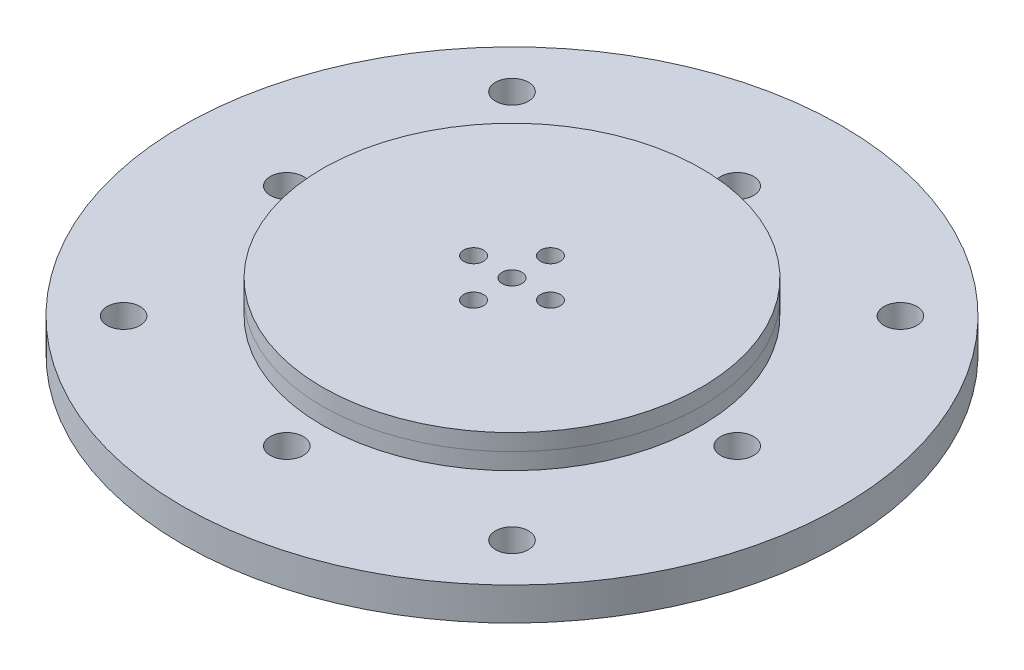
ISO-10303-21;
HEADER;
FILE_DESCRIPTION(('STEP AP214'),'2;1');
FILE_NAME('part.step','',(''),(''),'','','');
FILE_SCHEMA(('AUTOMOTIVE_DESIGN { 1 0 10303 214 1 1 1 1 }'));
ENDSEC;
DATA;
#1=APPLICATION_CONTEXT('core data for automotive mechanical design processes');
#2=APPLICATION_PROTOCOL_DEFINITION('international standard','automotive_design',2000,#1);
#3=PRODUCT_CONTEXT('',#1,'mechanical');
#4=PRODUCT('Part','Part','',(#3));
#5=PRODUCT_RELATED_PRODUCT_CATEGORY('part','',(#4));
#6=PRODUCT_DEFINITION_FORMATION('','',#4);
#7=PRODUCT_DEFINITION_CONTEXT('part definition',#1,'design');
#8=PRODUCT_DEFINITION('design','',#6,#7);
#9=PRODUCT_DEFINITION_SHAPE('','',#8);
#10=(LENGTH_UNIT() NAMED_UNIT(*) SI_UNIT(.MILLI.,.METRE.));
#11=(NAMED_UNIT(*) PLANE_ANGLE_UNIT() SI_UNIT($,.RADIAN.));
#12=(NAMED_UNIT(*) SI_UNIT($,.STERADIAN.) SOLID_ANGLE_UNIT());
#13=UNCERTAINTY_MEASURE_WITH_UNIT(LENGTH_MEASURE(1.E-05),#10,'distance_accuracy_value','');
#14=(GEOMETRIC_REPRESENTATION_CONTEXT(3) GLOBAL_UNCERTAINTY_ASSIGNED_CONTEXT((#13)) GLOBAL_UNIT_ASSIGNED_CONTEXT((#10,
#11,#12)) REPRESENTATION_CONTEXT('',''));
#15=CARTESIAN_POINT('',(0.,0.,0.));
#16=DIRECTION('',(0.,0.,1.));
#17=DIRECTION('',(1.,0.,0.));
#18=AXIS2_PLACEMENT_3D('',#15,#16,#17);
#19=CARTESIAN_POINT('',(0.,3.,0.));
#20=DIRECTION('',(0.,1.,0.));
#21=DIRECTION('',(0.,0.,1.));
#22=AXIS2_PLACEMENT_3D('',#19,#20,#21);
#23=PLANE('',#22);
#24=CARTESIAN_POINT('',(0.,3.,0.));
#25=DIRECTION('',(0.,1.,0.));
#26=DIRECTION('',(0.,0.,1.));
#27=AXIS2_PLACEMENT_3D('',#24,#25,#26);
#28=CIRCLE('',#27,34.5);
#29=CARTESIAN_POINT('',(0.,3.,34.5));
#30=VERTEX_POINT('',#29);
#31=EDGE_CURVE('E68',#30,#30,#28,.T.);
#32=ORIENTED_EDGE('',*,*,#31,.T.);
#33=EDGE_LOOP('',(#32));
#34=FACE_BOUND('',#33,.T.);
#35=CARTESIAN_POINT('',(7.,3.,0.));
#36=DIRECTION('',(0.,1.,0.));
#37=DIRECTION('',(0.,0.,1.));
#38=AXIS2_PLACEMENT_3D('',#35,#36,#37);
#39=CIRCLE('',#38,1.8);
#40=CARTESIAN_POINT('',(7.,3.,1.8));
#41=VERTEX_POINT('',#40);
#42=EDGE_CURVE('E74',#41,#41,#39,.F.);
#43=ORIENTED_EDGE('',*,*,#42,.T.);
#44=EDGE_LOOP('',(#43));
#45=FACE_BOUND('',#44,.T.);
#46=CARTESIAN_POINT('',(0.,3.,-7.));
#47=DIRECTION('',(0.,1.,0.));
#48=DIRECTION('',(0.,0.,1.));
#49=AXIS2_PLACEMENT_3D('',#46,#47,#48);
#50=CIRCLE('',#49,1.8);
#51=CARTESIAN_POINT('',(0.,3.,-5.2));
#52=VERTEX_POINT('',#51);
#53=EDGE_CURVE('E76',#52,#52,#50,.F.);
#54=ORIENTED_EDGE('',*,*,#53,.T.);
#55=EDGE_LOOP('',(#54));
#56=FACE_BOUND('',#55,.T.);
#57=CARTESIAN_POINT('',(0.,3.,0.));
#58=DIRECTION('',(0.,1.,0.));
#59=DIRECTION('',(0.,0.,1.));
#60=AXIS2_PLACEMENT_3D('',#57,#58,#59);
#61=CIRCLE('',#60,1.8);
#62=CARTESIAN_POINT('',(0.,3.,1.8));
#63=VERTEX_POINT('',#62);
#64=EDGE_CURVE('E52',#63,#63,#61,.F.);
#65=ORIENTED_EDGE('',*,*,#64,.T.);
#66=EDGE_LOOP('',(#65));
#67=FACE_BOUND('',#66,.T.);
#68=CARTESIAN_POINT('',(0.,3.,7.));
#69=DIRECTION('',(0.,1.,0.));
#70=DIRECTION('',(0.,0.,1.));
#71=AXIS2_PLACEMENT_3D('',#68,#69,#70);
#72=CIRCLE('',#71,1.8);
#73=CARTESIAN_POINT('',(0.,3.,8.8));
#74=VERTEX_POINT('',#73);
#75=EDGE_CURVE('E77',#74,#74,#72,.F.);
#76=ORIENTED_EDGE('',*,*,#75,.T.);
#77=EDGE_LOOP('',(#76));
#78=FACE_BOUND('',#77,.T.);
#79=CARTESIAN_POINT('',(-7.,3.,0.));
#80=DIRECTION('',(0.,1.,0.));
#81=DIRECTION('',(0.,0.,1.));
#82=AXIS2_PLACEMENT_3D('',#79,#80,#81);
#83=CIRCLE('',#82,1.8);
#84=CARTESIAN_POINT('',(-7.,3.,1.8));
#85=VERTEX_POINT('',#84);
#86=EDGE_CURVE('E69',#85,#85,#83,.F.);
#87=ORIENTED_EDGE('',*,*,#86,.T.);
#88=EDGE_LOOP('',(#87));
#89=FACE_BOUND('',#88,.T.);
#90=ADVANCED_FACE('F47',(#34,#45,#56,#67,#78,#89),#23,.T.);
#91=CARTESIAN_POINT('',(0.,3.,0.));
#92=DIRECTION('',(0.,-1.,0.));
#93=DIRECTION('',(0.,0.,-1.));
#94=AXIS2_PLACEMENT_3D('',#91,#92,#93);
#95=CYLINDRICAL_SURFACE('',#94,34.5);
#96=CARTESIAN_POINT('',(0.,0.,0.));
#97=DIRECTION('',(0.,1.,0.));
#98=DIRECTION('',(0.,0.,1.));
#99=AXIS2_PLACEMENT_3D('',#96,#97,#98);
#100=CIRCLE('',#99,34.5);
#101=CARTESIAN_POINT('',(0.,0.,34.5));
#102=VERTEX_POINT('',#101);
#103=EDGE_CURVE('E67',#102,#102,#100,.T.);
#104=ORIENTED_EDGE('',*,*,#103,.T.);
#105=EDGE_LOOP('',(#104));
#106=FACE_BOUND('',#105,.T.);
#107=ORIENTED_EDGE('',*,*,#31,.F.);
#108=EDGE_LOOP('',(#107));
#109=FACE_BOUND('',#108,.T.);
#110=ADVANCED_FACE('F51',(#106,#109),#95,.T.);
#111=CARTESIAN_POINT('',(-7.,-6.,0.));
#112=DIRECTION('',(0.,-1.,0.));
#113=DIRECTION('',(0.,0.,-1.));
#114=AXIS2_PLACEMENT_3D('',#111,#112,#113);
#115=CYLINDRICAL_SURFACE('',#114,1.8);
#116=CARTESIAN_POINT('',(-7.,-3.,0.));
#117=DIRECTION('',(0.,-1.,0.));
#118=DIRECTION('',(0.,0.,-1.));
#119=AXIS2_PLACEMENT_3D('',#116,#117,#118);
#120=CIRCLE('',#119,1.8);
#121=CARTESIAN_POINT('',(-7.,-3.,-1.8));
#122=VERTEX_POINT('',#121);
#123=EDGE_CURVE('E325',#122,#122,#120,.T.);
#124=ORIENTED_EDGE('',*,*,#123,.T.);
#125=EDGE_LOOP('',(#124));
#126=FACE_BOUND('',#125,.T.);
#127=ORIENTED_EDGE('',*,*,#86,.F.);
#128=EDGE_LOOP('',(#127));
#129=FACE_BOUND('',#128,.T.);
#130=ADVANCED_FACE('F110',(#126,#129),#115,.F.);
#131=CARTESIAN_POINT('',(7.,-6.,0.));
#132=DIRECTION('',(0.,-1.,0.));
#133=DIRECTION('',(0.,0.,-1.));
#134=AXIS2_PLACEMENT_3D('',#131,#132,#133);
#135=CYLINDRICAL_SURFACE('',#134,1.8);
#136=CARTESIAN_POINT('',(7.,-3.,0.));
#137=DIRECTION('',(0.,-1.,0.));
#138=DIRECTION('',(0.,0.,-1.));
#139=AXIS2_PLACEMENT_3D('',#136,#137,#138);
#140=CIRCLE('',#139,1.8);
#141=CARTESIAN_POINT('',(7.,-3.,-1.8));
#142=VERTEX_POINT('',#141);
#143=EDGE_CURVE('E132',#142,#142,#140,.T.);
#144=ORIENTED_EDGE('',*,*,#143,.T.);
#145=EDGE_LOOP('',(#144));
#146=FACE_BOUND('',#145,.T.);
#147=ORIENTED_EDGE('',*,*,#42,.F.);
#148=EDGE_LOOP('',(#147));
#149=FACE_BOUND('',#148,.T.);
#150=ADVANCED_FACE('F113',(#146,#149),#135,.F.);
#151=CARTESIAN_POINT('',(0.,-6.,7.));
#152=DIRECTION('',(0.,-1.,0.));
#153=DIRECTION('',(0.,0.,-1.));
#154=AXIS2_PLACEMENT_3D('',#151,#152,#153);
#155=CYLINDRICAL_SURFACE('',#154,1.8);
#156=CARTESIAN_POINT('',(0.,-3.,7.));
#157=DIRECTION('',(0.,-1.,0.));
#158=DIRECTION('',(0.,0.,-1.));
#159=AXIS2_PLACEMENT_3D('',#156,#157,#158);
#160=CIRCLE('',#159,1.8);
#161=CARTESIAN_POINT('',(0.,-3.,5.2));
#162=VERTEX_POINT('',#161);
#163=EDGE_CURVE('E148',#162,#162,#160,.T.);
#164=ORIENTED_EDGE('',*,*,#163,.T.);
#165=EDGE_LOOP('',(#164));
#166=FACE_BOUND('',#165,.T.);
#167=ORIENTED_EDGE('',*,*,#75,.F.);
#168=EDGE_LOOP('',(#167));
#169=FACE_BOUND('',#168,.T.);
#170=ADVANCED_FACE('F103',(#166,#169),#155,.F.);
#171=CARTESIAN_POINT('',(0.,-6.,-7.));
#172=DIRECTION('',(0.,-1.,0.));
#173=DIRECTION('',(0.,0.,-1.));
#174=AXIS2_PLACEMENT_3D('',#171,#172,#173);
#175=CYLINDRICAL_SURFACE('',#174,1.8);
#176=CARTESIAN_POINT('',(0.,-3.,-7.));
#177=DIRECTION('',(0.,-1.,0.));
#178=DIRECTION('',(0.,0.,-1.));
#179=AXIS2_PLACEMENT_3D('',#176,#177,#178);
#180=CIRCLE('',#179,1.8);
#181=CARTESIAN_POINT('',(0.,-3.,-8.8));
#182=VERTEX_POINT('',#181);
#183=EDGE_CURVE('E159',#182,#182,#180,.T.);
#184=ORIENTED_EDGE('',*,*,#183,.T.);
#185=EDGE_LOOP('',(#184));
#186=FACE_BOUND('',#185,.T.);
#187=ORIENTED_EDGE('',*,*,#53,.F.);
#188=EDGE_LOOP('',(#187));
#189=FACE_BOUND('',#188,.T.);
#190=ADVANCED_FACE('F89',(#186,#189),#175,.F.);
#191=CARTESIAN_POINT('',(0.,-6.,0.));
#192=DIRECTION('',(0.,-1.,0.));
#193=DIRECTION('',(0.,0.,-1.));
#194=AXIS2_PLACEMENT_3D('',#191,#192,#193);
#195=CYLINDRICAL_SURFACE('',#194,1.8);
#196=CARTESIAN_POINT('',(0.,-3.,0.));
#197=DIRECTION('',(0.,-1.,0.));
#198=DIRECTION('',(0.,0.,-1.));
#199=AXIS2_PLACEMENT_3D('',#196,#197,#198);
#200=CIRCLE('',#199,1.8);
#201=CARTESIAN_POINT('',(0.,-3.,-1.8));
#202=VERTEX_POINT('',#201);
#203=EDGE_CURVE('E65',#202,#202,#200,.T.);
#204=ORIENTED_EDGE('',*,*,#203,.T.);
#205=EDGE_LOOP('',(#204));
#206=FACE_BOUND('',#205,.T.);
#207=ORIENTED_EDGE('',*,*,#64,.F.);
#208=EDGE_LOOP('',(#207));
#209=FACE_BOUND('',#208,.T.);
#210=ADVANCED_FACE('F90',(#206,#209),#195,.F.);
#211=CARTESIAN_POINT('',(0.,-6.,0.));
#212=DIRECTION('',(0.,1.,0.));
#213=DIRECTION('',(0.,0.,1.));
#214=AXIS2_PLACEMENT_3D('',#211,#212,#213);
#215=CYLINDRICAL_SURFACE('',#214,60.);
#216=CARTESIAN_POINT('',(0.,-6.,0.));
#217=DIRECTION('',(0.,1.,0.));
#218=DIRECTION('',(0.,0.,1.));
#219=AXIS2_PLACEMENT_3D('',#216,#217,#218);
#220=CIRCLE('',#219,60.);
#221=CARTESIAN_POINT('',(0.,-6.,60.));
#222=VERTEX_POINT('',#221);
#223=EDGE_CURVE('E287',#222,#222,#220,.T.);
#224=ORIENTED_EDGE('',*,*,#223,.T.);
#225=EDGE_LOOP('',(#224));
#226=FACE_BOUND('',#225,.T.);
#227=CARTESIAN_POINT('',(0.,0.,0.));
#228=DIRECTION('',(0.,1.,0.));
#229=DIRECTION('',(0.,0.,1.));
#230=AXIS2_PLACEMENT_3D('',#227,#228,#229);
#231=CIRCLE('',#230,60.);
#232=CARTESIAN_POINT('',(0.,0.,60.));
#233=VERTEX_POINT('',#232);
#234=EDGE_CURVE('E284',#233,#233,#231,.T.);
#235=ORIENTED_EDGE('',*,*,#234,.F.);
#236=EDGE_LOOP('',(#235));
#237=FACE_BOUND('',#236,.T.);
#238=ADVANCED_FACE('F87',(#226,#237),#215,.T.);
#239=CARTESIAN_POINT('',(0.,-6.,0.));
#240=DIRECTION('',(0.,1.,0.));
#241=DIRECTION('',(0.,0.,1.));
#242=AXIS2_PLACEMENT_3D('',#239,#240,#241);
#243=PLANE('',#242);
#244=CARTESIAN_POINT('',(0.,-6.,0.));
#245=DIRECTION('',(0.,-1.,0.));
#246=DIRECTION('',(0.,0.,-1.));
#247=AXIS2_PLACEMENT_3D('',#244,#245,#246);
#248=CIRCLE('',#247,3.25);
#249=CARTESIAN_POINT('',(0.,-6.,-3.25));
#250=VERTEX_POINT('',#249);
#251=EDGE_CURVE('E13',#250,#250,#248,.T.);
#252=ORIENTED_EDGE('',*,*,#251,.F.);
#253=EDGE_LOOP('',(#252));
#254=FACE_BOUND('',#253,.T.);
#255=CARTESIAN_POINT('',(0.,-6.,-7.));
#256=DIRECTION('',(0.,-1.,0.));
#257=DIRECTION('',(0.,0.,-1.));
#258=AXIS2_PLACEMENT_3D('',#255,#256,#257);
#259=CIRCLE('',#258,3.25);
#260=CARTESIAN_POINT('',(0.,-6.,-10.25));
#261=VERTEX_POINT('',#260);
#262=EDGE_CURVE('E165',#261,#261,#259,.T.);
#263=ORIENTED_EDGE('',*,*,#262,.F.);
#264=EDGE_LOOP('',(#263));
#265=FACE_BOUND('',#264,.T.);
#266=CARTESIAN_POINT('',(0.,-6.,7.));
#267=DIRECTION('',(0.,-1.,0.));
#268=DIRECTION('',(0.,0.,-1.));
#269=AXIS2_PLACEMENT_3D('',#266,#267,#268);
#270=CIRCLE('',#269,3.25);
#271=CARTESIAN_POINT('',(0.,-6.,3.75));
#272=VERTEX_POINT('',#271);
#273=EDGE_CURVE('E154',#272,#272,#270,.T.);
#274=ORIENTED_EDGE('',*,*,#273,.F.);
#275=EDGE_LOOP('',(#274));
#276=FACE_BOUND('',#275,.T.);
#277=CARTESIAN_POINT('',(7.,-6.,0.));
#278=DIRECTION('',(0.,-1.,0.));
#279=DIRECTION('',(0.,0.,-1.));
#280=AXIS2_PLACEMENT_3D('',#277,#278,#279);
#281=CIRCLE('',#280,3.25);
#282=CARTESIAN_POINT('',(7.,-6.,-3.25));
#283=VERTEX_POINT('',#282);
#284=EDGE_CURVE('E140',#283,#283,#281,.T.);
#285=ORIENTED_EDGE('',*,*,#284,.F.);
#286=EDGE_LOOP('',(#285));
#287=FACE_BOUND('',#286,.T.);
#288=CARTESIAN_POINT('',(-7.,-6.,0.));
#289=DIRECTION('',(0.,-1.,0.));
#290=DIRECTION('',(0.,0.,-1.));
#291=AXIS2_PLACEMENT_3D('',#288,#289,#290);
#292=CIRCLE('',#291,3.25);
#293=CARTESIAN_POINT('',(-7.,-6.,-3.25));
#294=VERTEX_POINT('',#293);
#295=EDGE_CURVE('E137',#294,#294,#292,.T.);
#296=ORIENTED_EDGE('',*,*,#295,.F.);
#297=EDGE_LOOP('',(#296));
#298=FACE_BOUND('',#297,.T.);
#299=CARTESIAN_POINT('',(35.3553390593273,-6.,-35.3553390593274));
#300=DIRECTION('',(0.,-1.,0.));
#301=DIRECTION('',(0.,0.,-1.));
#302=AXIS2_PLACEMENT_3D('',#299,#300,#301);
#303=CIRCLE('',#302,3.);
#304=CARTESIAN_POINT('',(35.3553390593273,-6.,-38.3553390593274));
#305=VERTEX_POINT('',#304);
#306=EDGE_CURVE('E316',#305,#305,#303,.T.);
#307=ORIENTED_EDGE('',*,*,#306,.F.);
#308=EDGE_LOOP('',(#307));
#309=FACE_BOUND('',#308,.T.);
#310=CARTESIAN_POINT('',(-35.3553390593273,-6.,35.3553390593274));
#311=DIRECTION('',(0.,-1.,0.));
#312=DIRECTION('',(0.,0.,-1.));
#313=AXIS2_PLACEMENT_3D('',#310,#311,#312);
#314=CIRCLE('',#313,3.);
#315=CARTESIAN_POINT('',(-35.3553390593273,-6.,32.3553390593274));
#316=VERTEX_POINT('',#315);
#317=EDGE_CURVE('E314',#316,#316,#314,.T.);
#318=ORIENTED_EDGE('',*,*,#317,.F.);
#319=EDGE_LOOP('',(#318));
#320=FACE_BOUND('',#319,.T.);
#321=CARTESIAN_POINT('',(35.3553390593273,-6.,35.3553390593274));
#322=DIRECTION('',(0.,-1.,0.));
#323=DIRECTION('',(0.,0.,-1.));
#324=AXIS2_PLACEMENT_3D('',#321,#322,#323);
#325=CIRCLE('',#324,3.);
#326=CARTESIAN_POINT('',(35.3553390593273,-6.,32.3553390593274));
#327=VERTEX_POINT('',#326);
#328=EDGE_CURVE('E315',#327,#327,#325,.T.);
#329=ORIENTED_EDGE('',*,*,#328,.F.);
#330=EDGE_LOOP('',(#329));
#331=FACE_BOUND('',#330,.T.);
#332=CARTESIAN_POINT('',(-35.3553390593273,-6.,-35.3553390593274));
#333=DIRECTION('',(0.,-1.,0.));
#334=DIRECTION('',(0.,0.,-1.));
#335=AXIS2_PLACEMENT_3D('',#332,#333,#334);
#336=CIRCLE('',#335,3.);
#337=CARTESIAN_POINT('',(-35.3553390593273,-6.,-38.3553390593274));
#338=VERTEX_POINT('',#337);
#339=EDGE_CURVE('E308',#338,#338,#336,.T.);
#340=ORIENTED_EDGE('',*,*,#339,.F.);
#341=EDGE_LOOP('',(#340));
#342=FACE_BOUND('',#341,.T.);
#343=CARTESIAN_POINT('',(0.,-6.,-41.));
#344=DIRECTION('',(0.,-1.,0.));
#345=DIRECTION('',(0.,0.,-1.));
#346=AXIS2_PLACEMENT_3D('',#343,#344,#345);
#347=CIRCLE('',#346,2.99999999999999);
#348=CARTESIAN_POINT('',(0.,-6.,-44.));
#349=VERTEX_POINT('',#348);
#350=EDGE_CURVE('E304',#349,#349,#347,.T.);
#351=ORIENTED_EDGE('',*,*,#350,.F.);
#352=EDGE_LOOP('',(#351));
#353=FACE_BOUND('',#352,.T.);
#354=CARTESIAN_POINT('',(0.,-6.,41.));
#355=DIRECTION('',(0.,-1.,0.));
#356=DIRECTION('',(0.,0.,-1.));
#357=AXIS2_PLACEMENT_3D('',#354,#355,#356);
#358=CIRCLE('',#357,2.99999999999999);
#359=CARTESIAN_POINT('',(0.,-6.,38.));
#360=VERTEX_POINT('',#359);
#361=EDGE_CURVE('E305',#360,#360,#358,.T.);
#362=ORIENTED_EDGE('',*,*,#361,.F.);
#363=EDGE_LOOP('',(#362));
#364=FACE_BOUND('',#363,.T.);
#365=CARTESIAN_POINT('',(-41.,-6.,0.));
#366=DIRECTION('',(0.,-1.,0.));
#367=DIRECTION('',(0.,0.,-1.));
#368=AXIS2_PLACEMENT_3D('',#365,#366,#367);
#369=CIRCLE('',#368,2.99999999999999);
#370=CARTESIAN_POINT('',(-41.,-6.,-2.99999999999999));
#371=VERTEX_POINT('',#370);
#372=EDGE_CURVE('E299',#371,#371,#369,.T.);
#373=ORIENTED_EDGE('',*,*,#372,.F.);
#374=EDGE_LOOP('',(#373));
#375=FACE_BOUND('',#374,.T.);
#376=CARTESIAN_POINT('',(41.,-6.,0.));
#377=DIRECTION('',(0.,-1.,0.));
#378=DIRECTION('',(0.,0.,-1.));
#379=AXIS2_PLACEMENT_3D('',#376,#377,#378);
#380=CIRCLE('',#379,2.99999999999999);
#381=CARTESIAN_POINT('',(41.,-6.,-2.99999999999999));
#382=VERTEX_POINT('',#381);
#383=EDGE_CURVE('E288',#382,#382,#380,.T.);
#384=ORIENTED_EDGE('',*,*,#383,.F.);
#385=EDGE_LOOP('',(#384));
#386=FACE_BOUND('',#385,.T.);
#387=ORIENTED_EDGE('',*,*,#223,.F.);
#388=EDGE_LOOP('',(#387));
#389=FACE_BOUND('',#388,.T.);
#390=ADVANCED_FACE('F96',(#254,#265,#276,#287,#298,#309,#320,#331,#342,#353,#364,#375,#386,
#389),#243,.F.);
#391=CARTESIAN_POINT('',(0.,0.,0.));
#392=DIRECTION('',(0.,1.,0.));
#393=DIRECTION('',(0.,0.,1.));
#394=AXIS2_PLACEMENT_3D('',#391,#392,#393);
#395=PLANE('',#394);
#396=CARTESIAN_POINT('',(35.3553390593273,0.,-35.3553390593274));
#397=DIRECTION('',(0.,1.,0.));
#398=DIRECTION('',(0.,0.,1.));
#399=AXIS2_PLACEMENT_3D('',#396,#397,#398);
#400=CIRCLE('',#399,3.);
#401=CARTESIAN_POINT('',(35.3553390593273,0.,-32.3553390593274));
#402=VERTEX_POINT('',#401);
#403=EDGE_CURVE('E254',#402,#402,#400,.T.);
#404=ORIENTED_EDGE('',*,*,#403,.F.);
#405=EDGE_LOOP('',(#404));
#406=FACE_BOUND('',#405,.T.);
#407=CARTESIAN_POINT('',(-35.3553390593273,0.,35.3553390593274));
#408=DIRECTION('',(0.,1.,0.));
#409=DIRECTION('',(0.,0.,1.));
#410=AXIS2_PLACEMENT_3D('',#407,#408,#409);
#411=CIRCLE('',#410,3.);
#412=CARTESIAN_POINT('',(-35.3553390593273,0.,38.3553390593274));
#413=VERTEX_POINT('',#412);
#414=EDGE_CURVE('E260',#413,#413,#411,.T.);
#415=ORIENTED_EDGE('',*,*,#414,.F.);
#416=EDGE_LOOP('',(#415));
#417=FACE_BOUND('',#416,.T.);
#418=CARTESIAN_POINT('',(35.3553390593273,0.,35.3553390593274));
#419=DIRECTION('',(0.,1.,0.));
#420=DIRECTION('',(0.,0.,1.));
#421=AXIS2_PLACEMENT_3D('',#418,#419,#420);
#422=CIRCLE('',#421,3.);
#423=CARTESIAN_POINT('',(35.3553390593273,0.,38.3553390593274));
#424=VERTEX_POINT('',#423);
#425=EDGE_CURVE('E263',#424,#424,#422,.T.);
#426=ORIENTED_EDGE('',*,*,#425,.F.);
#427=EDGE_LOOP('',(#426));
#428=FACE_BOUND('',#427,.T.);
#429=CARTESIAN_POINT('',(-35.3553390593273,0.,-35.3553390593274));
#430=DIRECTION('',(0.,1.,0.));
#431=DIRECTION('',(0.,0.,1.));
#432=AXIS2_PLACEMENT_3D('',#429,#430,#431);
#433=CIRCLE('',#432,3.);
#434=CARTESIAN_POINT('',(-35.3553390593273,0.,-32.3553390593274));
#435=VERTEX_POINT('',#434);
#436=EDGE_CURVE('E264',#435,#435,#433,.T.);
#437=ORIENTED_EDGE('',*,*,#436,.F.);
#438=EDGE_LOOP('',(#437));
#439=FACE_BOUND('',#438,.T.);
#440=CARTESIAN_POINT('',(0.,0.,-41.));
#441=DIRECTION('',(0.,1.,0.));
#442=DIRECTION('',(0.,0.,1.));
#443=AXIS2_PLACEMENT_3D('',#440,#441,#442);
#444=CIRCLE('',#443,2.99999999999999);
#445=CARTESIAN_POINT('',(0.,0.,-38.));
#446=VERTEX_POINT('',#445);
#447=EDGE_CURVE('E268',#446,#446,#444,.T.);
#448=ORIENTED_EDGE('',*,*,#447,.F.);
#449=EDGE_LOOP('',(#448));
#450=FACE_BOUND('',#449,.T.);
#451=CARTESIAN_POINT('',(0.,0.,41.));
#452=DIRECTION('',(0.,1.,0.));
#453=DIRECTION('',(0.,0.,1.));
#454=AXIS2_PLACEMENT_3D('',#451,#452,#453);
#455=CIRCLE('',#454,2.99999999999999);
#456=CARTESIAN_POINT('',(0.,0.,44.));
#457=VERTEX_POINT('',#456);
#458=EDGE_CURVE('E271',#457,#457,#455,.T.);
#459=ORIENTED_EDGE('',*,*,#458,.F.);
#460=EDGE_LOOP('',(#459));
#461=FACE_BOUND('',#460,.T.);
#462=CARTESIAN_POINT('',(-41.,0.,0.));
#463=DIRECTION('',(0.,1.,0.));
#464=DIRECTION('',(0.,0.,1.));
#465=AXIS2_PLACEMENT_3D('',#462,#463,#464);
#466=CIRCLE('',#465,2.99999999999999);
#467=CARTESIAN_POINT('',(-41.,0.,2.99999999999999));
#468=VERTEX_POINT('',#467);
#469=EDGE_CURVE('E280',#468,#468,#466,.T.);
#470=ORIENTED_EDGE('',*,*,#469,.F.);
#471=EDGE_LOOP('',(#470));
#472=FACE_BOUND('',#471,.T.);
#473=CARTESIAN_POINT('',(41.,0.,0.));
#474=DIRECTION('',(0.,1.,0.));
#475=DIRECTION('',(0.,0.,1.));
#476=AXIS2_PLACEMENT_3D('',#473,#474,#475);
#477=CIRCLE('',#476,2.99999999999999);
#478=CARTESIAN_POINT('',(41.,0.,2.99999999999999));
#479=VERTEX_POINT('',#478);
#480=EDGE_CURVE('E283',#479,#479,#477,.T.);
#481=ORIENTED_EDGE('',*,*,#480,.F.);
#482=EDGE_LOOP('',(#481));
#483=FACE_BOUND('',#482,.T.);
#484=ORIENTED_EDGE('',*,*,#103,.F.);
#485=EDGE_LOOP('',(#484));
#486=FACE_BOUND('',#485,.T.);
#487=ORIENTED_EDGE('',*,*,#234,.T.);
#488=EDGE_LOOP('',(#487));
#489=FACE_BOUND('',#488,.T.);
#490=ADVANCED_FACE('F241',(#406,#417,#428,#439,#450,#461,#472,#483,#486,#489),#395,.T.);
#491=CARTESIAN_POINT('',(41.,-6.,0.));
#492=DIRECTION('',(0.,-1.,0.));
#493=DIRECTION('',(0.,0.,-1.));
#494=AXIS2_PLACEMENT_3D('',#491,#492,#493);
#495=CYLINDRICAL_SURFACE('',#494,2.99999999999999);
#496=ORIENTED_EDGE('',*,*,#480,.T.);
#497=EDGE_LOOP('',(#496));
#498=FACE_BOUND('',#497,.T.);
#499=ORIENTED_EDGE('',*,*,#383,.T.);
#500=EDGE_LOOP('',(#499));
#501=FACE_BOUND('',#500,.T.);
#502=ADVANCED_FACE('F240',(#498,#501),#495,.F.);
#503=CARTESIAN_POINT('',(-41.,-6.,0.));
#504=DIRECTION('',(0.,-1.,0.));
#505=DIRECTION('',(0.,0.,-1.));
#506=AXIS2_PLACEMENT_3D('',#503,#504,#505);
#507=CYLINDRICAL_SURFACE('',#506,2.99999999999999);
#508=ORIENTED_EDGE('',*,*,#469,.T.);
#509=EDGE_LOOP('',(#508));
#510=FACE_BOUND('',#509,.T.);
#511=ORIENTED_EDGE('',*,*,#372,.T.);
#512=EDGE_LOOP('',(#511));
#513=FACE_BOUND('',#512,.T.);
#514=ADVANCED_FACE('F231',(#510,#513),#507,.F.);
#515=CARTESIAN_POINT('',(0.,-6.,41.));
#516=DIRECTION('',(0.,-1.,0.));
#517=DIRECTION('',(0.,0.,-1.));
#518=AXIS2_PLACEMENT_3D('',#515,#516,#517);
#519=CYLINDRICAL_SURFACE('',#518,2.99999999999999);
#520=ORIENTED_EDGE('',*,*,#458,.T.);
#521=EDGE_LOOP('',(#520));
#522=FACE_BOUND('',#521,.T.);
#523=ORIENTED_EDGE('',*,*,#361,.T.);
#524=EDGE_LOOP('',(#523));
#525=FACE_BOUND('',#524,.T.);
#526=ADVANCED_FACE('F230',(#522,#525),#519,.F.);
#527=CARTESIAN_POINT('',(0.,-6.,-41.));
#528=DIRECTION('',(0.,-1.,0.));
#529=DIRECTION('',(0.,0.,-1.));
#530=AXIS2_PLACEMENT_3D('',#527,#528,#529);
#531=CYLINDRICAL_SURFACE('',#530,2.99999999999999);
#532=ORIENTED_EDGE('',*,*,#447,.T.);
#533=EDGE_LOOP('',(#532));
#534=FACE_BOUND('',#533,.T.);
#535=ORIENTED_EDGE('',*,*,#350,.T.);
#536=EDGE_LOOP('',(#535));
#537=FACE_BOUND('',#536,.T.);
#538=ADVANCED_FACE('F225',(#534,#537),#531,.F.);
#539=CARTESIAN_POINT('',(-35.3553390593273,-6.,-35.3553390593274));
#540=DIRECTION('',(0.,-1.,0.));
#541=DIRECTION('',(0.,0.,-1.));
#542=AXIS2_PLACEMENT_3D('',#539,#540,#541);
#543=CYLINDRICAL_SURFACE('',#542,3.);
#544=ORIENTED_EDGE('',*,*,#436,.T.);
#545=EDGE_LOOP('',(#544));
#546=FACE_BOUND('',#545,.T.);
#547=ORIENTED_EDGE('',*,*,#339,.T.);
#548=EDGE_LOOP('',(#547));
#549=FACE_BOUND('',#548,.T.);
#550=ADVANCED_FACE('F221',(#546,#549),#543,.F.);
#551=CARTESIAN_POINT('',(35.3553390593273,-6.,35.3553390593274));
#552=DIRECTION('',(0.,-1.,0.));
#553=DIRECTION('',(0.,0.,-1.));
#554=AXIS2_PLACEMENT_3D('',#551,#552,#553);
#555=CYLINDRICAL_SURFACE('',#554,3.);
#556=ORIENTED_EDGE('',*,*,#425,.T.);
#557=EDGE_LOOP('',(#556));
#558=FACE_BOUND('',#557,.T.);
#559=ORIENTED_EDGE('',*,*,#328,.T.);
#560=EDGE_LOOP('',(#559));
#561=FACE_BOUND('',#560,.T.);
#562=ADVANCED_FACE('F220',(#558,#561),#555,.F.);
#563=CARTESIAN_POINT('',(-35.3553390593273,-6.,35.3553390593274));
#564=DIRECTION('',(0.,-1.,0.));
#565=DIRECTION('',(0.,0.,-1.));
#566=AXIS2_PLACEMENT_3D('',#563,#564,#565);
#567=CYLINDRICAL_SURFACE('',#566,3.);
#568=ORIENTED_EDGE('',*,*,#414,.T.);
#569=EDGE_LOOP('',(#568));
#570=FACE_BOUND('',#569,.T.);
#571=ORIENTED_EDGE('',*,*,#317,.T.);
#572=EDGE_LOOP('',(#571));
#573=FACE_BOUND('',#572,.T.);
#574=ADVANCED_FACE('F212',(#570,#573),#567,.F.);
#575=CARTESIAN_POINT('',(35.3553390593273,-6.,-35.3553390593274));
#576=DIRECTION('',(0.,-1.,0.));
#577=DIRECTION('',(0.,0.,-1.));
#578=AXIS2_PLACEMENT_3D('',#575,#576,#577);
#579=CYLINDRICAL_SURFACE('',#578,3.);
#580=ORIENTED_EDGE('',*,*,#403,.T.);
#581=EDGE_LOOP('',(#580));
#582=FACE_BOUND('',#581,.T.);
#583=ORIENTED_EDGE('',*,*,#306,.T.);
#584=EDGE_LOOP('',(#583));
#585=FACE_BOUND('',#584,.T.);
#586=ADVANCED_FACE('F209',(#582,#585),#579,.F.);
#587=CARTESIAN_POINT('',(-5.2,-3.,0.));
#588=DIRECTION('',(0.,1.,0.));
#589=DIRECTION('',(0.,0.,1.));
#590=AXIS2_PLACEMENT_3D('',#587,#588,#589);
#591=PLANE('',#590);
#592=ORIENTED_EDGE('',*,*,#123,.F.);
#593=EDGE_LOOP('',(#592));
#594=FACE_BOUND('',#593,.T.);
#595=CARTESIAN_POINT('',(-7.,-3.,0.));
#596=DIRECTION('',(0.,-1.,0.));
#597=DIRECTION('',(0.,0.,-1.));
#598=AXIS2_PLACEMENT_3D('',#595,#596,#597);
#599=CIRCLE('',#598,3.25);
#600=CARTESIAN_POINT('',(-7.,-3.,-3.25));
#601=VERTEX_POINT('',#600);
#602=EDGE_CURVE('E141',#601,#601,#599,.T.);
#603=ORIENTED_EDGE('',*,*,#602,.T.);
#604=EDGE_LOOP('',(#603));
#605=FACE_BOUND('',#604,.T.);
#606=ADVANCED_FACE('F205',(#594,#605),#591,.F.);
#607=CARTESIAN_POINT('',(-7.,-6.,0.));
#608=DIRECTION('',(0.,-1.,0.));
#609=DIRECTION('',(0.,0.,-1.));
#610=AXIS2_PLACEMENT_3D('',#607,#608,#609);
#611=CYLINDRICAL_SURFACE('',#610,3.25);
#612=ORIENTED_EDGE('',*,*,#602,.F.);
#613=EDGE_LOOP('',(#612));
#614=FACE_BOUND('',#613,.T.);
#615=ORIENTED_EDGE('',*,*,#295,.T.);
#616=EDGE_LOOP('',(#615));
#617=FACE_BOUND('',#616,.T.);
#618=ADVANCED_FACE('F202',(#614,#617),#611,.F.);
#619=CARTESIAN_POINT('',(8.8,-3.,0.));
#620=DIRECTION('',(0.,1.,0.));
#621=DIRECTION('',(0.,0.,1.));
#622=AXIS2_PLACEMENT_3D('',#619,#620,#621);
#623=PLANE('',#622);
#624=ORIENTED_EDGE('',*,*,#143,.F.);
#625=EDGE_LOOP('',(#624));
#626=FACE_BOUND('',#625,.T.);
#627=CARTESIAN_POINT('',(7.,-3.,0.));
#628=DIRECTION('',(0.,-1.,0.));
#629=DIRECTION('',(0.,0.,-1.));
#630=AXIS2_PLACEMENT_3D('',#627,#628,#629);
#631=CIRCLE('',#630,3.25);
#632=CARTESIAN_POINT('',(7.,-3.,-3.25));
#633=VERTEX_POINT('',#632);
#634=EDGE_CURVE('E136',#633,#633,#631,.T.);
#635=ORIENTED_EDGE('',*,*,#634,.T.);
#636=EDGE_LOOP('',(#635));
#637=FACE_BOUND('',#636,.T.);
#638=ADVANCED_FACE('F196',(#626,#637),#623,.F.);
#639=CARTESIAN_POINT('',(7.,-6.,0.));
#640=DIRECTION('',(0.,-1.,0.));
#641=DIRECTION('',(0.,0.,-1.));
#642=AXIS2_PLACEMENT_3D('',#639,#640,#641);
#643=CYLINDRICAL_SURFACE('',#642,3.25);
#644=ORIENTED_EDGE('',*,*,#634,.F.);
#645=EDGE_LOOP('',(#644));
#646=FACE_BOUND('',#645,.T.);
#647=ORIENTED_EDGE('',*,*,#284,.T.);
#648=EDGE_LOOP('',(#647));
#649=FACE_BOUND('',#648,.T.);
#650=ADVANCED_FACE('F193',(#646,#649),#643,.F.);
#651=CARTESIAN_POINT('',(1.8,-3.,7.));
#652=DIRECTION('',(0.,1.,0.));
#653=DIRECTION('',(0.,0.,1.));
#654=AXIS2_PLACEMENT_3D('',#651,#652,#653);
#655=PLANE('',#654);
#656=ORIENTED_EDGE('',*,*,#163,.F.);
#657=EDGE_LOOP('',(#656));
#658=FACE_BOUND('',#657,.T.);
#659=CARTESIAN_POINT('',(0.,-3.,7.));
#660=DIRECTION('',(0.,-1.,0.));
#661=DIRECTION('',(0.,0.,-1.));
#662=AXIS2_PLACEMENT_3D('',#659,#660,#661);
#663=CIRCLE('',#662,3.25);
#664=CARTESIAN_POINT('',(0.,-3.,3.75));
#665=VERTEX_POINT('',#664);
#666=EDGE_CURVE('E155',#665,#665,#663,.T.);
#667=ORIENTED_EDGE('',*,*,#666,.T.);
#668=EDGE_LOOP('',(#667));
#669=FACE_BOUND('',#668,.T.);
#670=ADVANCED_FACE('F188',(#658,#669),#655,.F.);
#671=CARTESIAN_POINT('',(0.,-6.,7.));
#672=DIRECTION('',(0.,-1.,0.));
#673=DIRECTION('',(0.,0.,-1.));
#674=AXIS2_PLACEMENT_3D('',#671,#672,#673);
#675=CYLINDRICAL_SURFACE('',#674,3.25);
#676=ORIENTED_EDGE('',*,*,#666,.F.);
#677=EDGE_LOOP('',(#676));
#678=FACE_BOUND('',#677,.T.);
#679=ORIENTED_EDGE('',*,*,#273,.T.);
#680=EDGE_LOOP('',(#679));
#681=FACE_BOUND('',#680,.T.);
#682=ADVANCED_FACE('F187',(#678,#681),#675,.F.);
#683=CARTESIAN_POINT('',(1.8,-3.,-7.));
#684=DIRECTION('',(0.,1.,0.));
#685=DIRECTION('',(0.,0.,1.));
#686=AXIS2_PLACEMENT_3D('',#683,#684,#685);
#687=PLANE('',#686);
#688=ORIENTED_EDGE('',*,*,#183,.F.);
#689=EDGE_LOOP('',(#688));
#690=FACE_BOUND('',#689,.T.);
#691=CARTESIAN_POINT('',(0.,-3.,-7.));
#692=DIRECTION('',(0.,-1.,0.));
#693=DIRECTION('',(0.,0.,-1.));
#694=AXIS2_PLACEMENT_3D('',#691,#692,#693);
#695=CIRCLE('',#694,3.25);
#696=CARTESIAN_POINT('',(0.,-3.,-10.25));
#697=VERTEX_POINT('',#696);
#698=EDGE_CURVE('E163',#697,#697,#695,.T.);
#699=ORIENTED_EDGE('',*,*,#698,.T.);
#700=EDGE_LOOP('',(#699));
#701=FACE_BOUND('',#700,.T.);
#702=ADVANCED_FACE('F185',(#690,#701),#687,.F.);
#703=CARTESIAN_POINT('',(0.,-6.,-7.));
#704=DIRECTION('',(0.,-1.,0.));
#705=DIRECTION('',(0.,0.,-1.));
#706=AXIS2_PLACEMENT_3D('',#703,#704,#705);
#707=CYLINDRICAL_SURFACE('',#706,3.25);
#708=ORIENTED_EDGE('',*,*,#698,.F.);
#709=EDGE_LOOP('',(#708));
#710=FACE_BOUND('',#709,.T.);
#711=ORIENTED_EDGE('',*,*,#262,.T.);
#712=EDGE_LOOP('',(#711));
#713=FACE_BOUND('',#712,.T.);
#714=ADVANCED_FACE('F171',(#710,#713),#707,.F.);
#715=CARTESIAN_POINT('',(1.8,-3.,0.));
#716=DIRECTION('',(0.,1.,0.));
#717=DIRECTION('',(0.,0.,1.));
#718=AXIS2_PLACEMENT_3D('',#715,#716,#717);
#719=PLANE('',#718);
#720=ORIENTED_EDGE('',*,*,#203,.F.);
#721=EDGE_LOOP('',(#720));
#722=FACE_BOUND('',#721,.T.);
#723=CARTESIAN_POINT('',(0.,-3.,0.));
#724=DIRECTION('',(0.,-1.,0.));
#725=DIRECTION('',(0.,0.,-1.));
#726=AXIS2_PLACEMENT_3D('',#723,#724,#725);
#727=CIRCLE('',#726,3.25);
#728=CARTESIAN_POINT('',(0.,-3.,-3.25));
#729=VERTEX_POINT('',#728);
#730=EDGE_CURVE('E60',#729,#729,#727,.T.);
#731=ORIENTED_EDGE('',*,*,#730,.T.);
#732=EDGE_LOOP('',(#731));
#733=FACE_BOUND('',#732,.T.);
#734=ADVANCED_FACE('F166',(#722,#733),#719,.F.);
#735=CARTESIAN_POINT('',(0.,-6.,0.));
#736=DIRECTION('',(0.,-1.,0.));
#737=DIRECTION('',(0.,0.,-1.));
#738=AXIS2_PLACEMENT_3D('',#735,#736,#737);
#739=CYLINDRICAL_SURFACE('',#738,3.25);
#740=ORIENTED_EDGE('',*,*,#730,.F.);
#741=EDGE_LOOP('',(#740));
#742=FACE_BOUND('',#741,.T.);
#743=ORIENTED_EDGE('',*,*,#251,.T.);
#744=EDGE_LOOP('',(#743));
#745=FACE_BOUND('',#744,.T.);
#746=ADVANCED_FACE('F116',(#742,#745),#739,.F.);
#747=CLOSED_SHELL('',(#90,#110,#130,#150,#170,#190,#210,#238,#390,#490,#502,#514,#526,#538,#550,
#562,#574,#586,#606,#618,#638,#650,#670,#682,#702,#714,#734,#746));
#748=MANIFOLD_SOLID_BREP('B2',#747);
#749=CARTESIAN_POINT('',(0.,3.,0.));
#750=DIRECTION('',(0.,1.,0.));
#751=DIRECTION('',(0.,0.,1.));
#752=AXIS2_PLACEMENT_3D('',#749,#750,#751);
#753=PLANE('',#752);
#754=CARTESIAN_POINT('',(-7.,3.,0.));
#755=DIRECTION('',(0.,1.,0.));
#756=DIRECTION('',(0.,0.,1.));
#757=AXIS2_PLACEMENT_3D('',#754,#755,#756);
#758=CIRCLE('',#757,1.8);
#759=CARTESIAN_POINT('',(-7.,3.,1.8));
#760=VERTEX_POINT('',#759);
#761=EDGE_CURVE('E551',#760,#760,#758,.F.);
#762=ORIENTED_EDGE('',*,*,#761,.F.);
#763=EDGE_LOOP('',(#762));
#764=FACE_BOUND('',#763,.T.);
#765=CARTESIAN_POINT('',(0.,3.,7.));
#766=DIRECTION('',(0.,1.,0.));
#767=DIRECTION('',(0.,0.,1.));
#768=AXIS2_PLACEMENT_3D('',#765,#766,#767);
#769=CIRCLE('',#768,1.8);
#770=CARTESIAN_POINT('',(0.,3.,8.8));
#771=VERTEX_POINT('',#770);
#772=EDGE_CURVE('E561',#771,#771,#769,.F.);
#773=ORIENTED_EDGE('',*,*,#772,.F.);
#774=EDGE_LOOP('',(#773));
#775=FACE_BOUND('',#774,.T.);
#776=CARTESIAN_POINT('',(0.,3.,0.));
#777=DIRECTION('',(0.,1.,0.));
#778=DIRECTION('',(0.,0.,1.));
#779=AXIS2_PLACEMENT_3D('',#776,#777,#778);
#780=CIRCLE('',#779,1.8);
#781=CARTESIAN_POINT('',(0.,3.,1.8));
#782=VERTEX_POINT('',#781);
#783=EDGE_CURVE('E567',#782,#782,#780,.F.);
#784=ORIENTED_EDGE('',*,*,#783,.F.);
#785=EDGE_LOOP('',(#784));
#786=FACE_BOUND('',#785,.T.);
#787=CARTESIAN_POINT('',(0.,3.,-7.));
#788=DIRECTION('',(0.,1.,0.));
#789=DIRECTION('',(0.,0.,1.));
#790=AXIS2_PLACEMENT_3D('',#787,#788,#789);
#791=CIRCLE('',#790,1.8);
#792=CARTESIAN_POINT('',(0.,3.,-5.2));
#793=VERTEX_POINT('',#792);
#794=EDGE_CURVE('E566',#793,#793,#791,.F.);
#795=ORIENTED_EDGE('',*,*,#794,.F.);
#796=EDGE_LOOP('',(#795));
#797=FACE_BOUND('',#796,.T.);
#798=CARTESIAN_POINT('',(7.,3.,0.));
#799=DIRECTION('',(0.,1.,0.));
#800=DIRECTION('',(0.,0.,1.));
#801=AXIS2_PLACEMENT_3D('',#798,#799,#800);
#802=CIRCLE('',#801,1.8);
#803=CARTESIAN_POINT('',(7.,3.,1.8));
#804=VERTEX_POINT('',#803);
#805=EDGE_CURVE('E560',#804,#804,#802,.F.);
#806=ORIENTED_EDGE('',*,*,#805,.F.);
#807=EDGE_LOOP('',(#806));
#808=FACE_BOUND('',#807,.T.);
#809=CARTESIAN_POINT('',(0.,3.,0.));
#810=DIRECTION('',(0.,1.,0.));
#811=DIRECTION('',(0.,0.,1.));
#812=AXIS2_PLACEMENT_3D('',#809,#810,#811);
#813=CIRCLE('',#812,34.5);
#814=CARTESIAN_POINT('',(0.,3.,34.5));
#815=VERTEX_POINT('',#814);
#816=EDGE_CURVE('E48',#815,#815,#813,.T.);
#817=ORIENTED_EDGE('',*,*,#816,.F.);
#818=EDGE_LOOP('',(#817));
#819=FACE_BOUND('',#818,.T.);
#820=ADVANCED_FACE('F547',(#764,#775,#786,#797,#808,#819),#753,.F.);
#821=CARTESIAN_POINT('',(0.,6.,0.));
#822=DIRECTION('',(0.,1.,0.));
#823=DIRECTION('',(0.,0.,1.));
#824=AXIS2_PLACEMENT_3D('',#821,#822,#823);
#825=PLANE('',#824);
#826=CARTESIAN_POINT('',(0.,6.,0.));
#827=DIRECTION('',(0.,1.,0.));
#828=DIRECTION('',(0.,0.,1.));
#829=AXIS2_PLACEMENT_3D('',#826,#827,#828);
#830=CIRCLE('',#829,1.8);
#831=CARTESIAN_POINT('',(0.,6.,1.8));
#832=VERTEX_POINT('',#831);
#833=EDGE_CURVE('E590',#832,#832,#830,.F.);
#834=ORIENTED_EDGE('',*,*,#833,.T.);
#835=EDGE_LOOP('',(#834));
#836=FACE_BOUND('',#835,.T.);
#837=CARTESIAN_POINT('',(0.,6.,-7.));
#838=DIRECTION('',(0.,1.,0.));
#839=DIRECTION('',(0.,0.,1.));
#840=AXIS2_PLACEMENT_3D('',#837,#838,#839);
#841=CIRCLE('',#840,1.8);
#842=CARTESIAN_POINT('',(0.,6.,-5.2));
#843=VERTEX_POINT('',#842);
#844=EDGE_CURVE('E583',#843,#843,#841,.F.);
#845=ORIENTED_EDGE('',*,*,#844,.T.);
#846=EDGE_LOOP('',(#845));
#847=FACE_BOUND('',#846,.T.);
#848=CARTESIAN_POINT('',(0.,6.,7.));
#849=DIRECTION('',(0.,1.,0.));
#850=DIRECTION('',(0.,0.,1.));
#851=AXIS2_PLACEMENT_3D('',#848,#849,#850);
#852=CIRCLE('',#851,1.8);
#853=CARTESIAN_POINT('',(0.,6.,8.8));
#854=VERTEX_POINT('',#853);
#855=EDGE_CURVE('E581',#854,#854,#852,.F.);
#856=ORIENTED_EDGE('',*,*,#855,.T.);
#857=EDGE_LOOP('',(#856));
#858=FACE_BOUND('',#857,.T.);
#859=CARTESIAN_POINT('',(7.,6.,0.));
#860=DIRECTION('',(0.,1.,0.));
#861=DIRECTION('',(0.,0.,1.));
#862=AXIS2_PLACEMENT_3D('',#859,#860,#861);
#863=CIRCLE('',#862,1.8);
#864=CARTESIAN_POINT('',(7.,6.,1.8));
#865=VERTEX_POINT('',#864);
#866=EDGE_CURVE('E579',#865,#865,#863,.F.);
#867=ORIENTED_EDGE('',*,*,#866,.T.);
#868=EDGE_LOOP('',(#867));
#869=FACE_BOUND('',#868,.T.);
#870=CARTESIAN_POINT('',(-7.,6.,0.));
#871=DIRECTION('',(0.,1.,0.));
#872=DIRECTION('',(0.,0.,1.));
#873=AXIS2_PLACEMENT_3D('',#870,#871,#872);
#874=CIRCLE('',#873,1.8);
#875=CARTESIAN_POINT('',(-7.,6.,1.8));
#876=VERTEX_POINT('',#875);
#877=EDGE_CURVE('E574',#876,#876,#874,.F.);
#878=ORIENTED_EDGE('',*,*,#877,.T.);
#879=EDGE_LOOP('',(#878));
#880=FACE_BOUND('',#879,.T.);
#881=CARTESIAN_POINT('',(0.,6.,0.));
#882=DIRECTION('',(0.,1.,0.));
#883=DIRECTION('',(0.,0.,1.));
#884=AXIS2_PLACEMENT_3D('',#881,#882,#883);
#885=CIRCLE('',#884,34.5);
#886=CARTESIAN_POINT('',(0.,6.,34.5));
#887=VERTEX_POINT('',#886);
#888=EDGE_CURVE('E575',#887,#887,#885,.T.);
#889=ORIENTED_EDGE('',*,*,#888,.T.);
#890=EDGE_LOOP('',(#889));
#891=FACE_BOUND('',#890,.T.);
#892=ADVANCED_FACE('F591',(#836,#847,#858,#869,#880,#891),#825,.T.);
#893=CARTESIAN_POINT('',(0.,-6.,0.));
#894=DIRECTION('',(0.,-1.,0.));
#895=DIRECTION('',(0.,0.,-1.));
#896=AXIS2_PLACEMENT_3D('',#893,#894,#895);
#897=CYLINDRICAL_SURFACE('',#896,1.8);
#898=ORIENTED_EDGE('',*,*,#783,.T.);
#899=EDGE_LOOP('',(#898));
#900=FACE_BOUND('',#899,.T.);
#901=ORIENTED_EDGE('',*,*,#833,.F.);
#902=EDGE_LOOP('',(#901));
#903=FACE_BOUND('',#902,.T.);
#904=ADVANCED_FACE('F593',(#900,#903),#897,.F.);
#905=CARTESIAN_POINT('',(0.,-6.,-7.));
#906=DIRECTION('',(0.,-1.,0.));
#907=DIRECTION('',(0.,0.,-1.));
#908=AXIS2_PLACEMENT_3D('',#905,#906,#907);
#909=CYLINDRICAL_SURFACE('',#908,1.8);
#910=ORIENTED_EDGE('',*,*,#794,.T.);
#911=EDGE_LOOP('',(#910));
#912=FACE_BOUND('',#911,.T.);
#913=ORIENTED_EDGE('',*,*,#844,.F.);
#914=EDGE_LOOP('',(#913));
#915=FACE_BOUND('',#914,.T.);
#916=ADVANCED_FACE('F597',(#912,#915),#909,.F.);
#917=CARTESIAN_POINT('',(0.,-6.,7.));
#918=DIRECTION('',(0.,-1.,0.));
#919=DIRECTION('',(0.,0.,-1.));
#920=AXIS2_PLACEMENT_3D('',#917,#918,#919);
#921=CYLINDRICAL_SURFACE('',#920,1.8);
#922=ORIENTED_EDGE('',*,*,#772,.T.);
#923=EDGE_LOOP('',(#922));
#924=FACE_BOUND('',#923,.T.);
#925=ORIENTED_EDGE('',*,*,#855,.F.);
#926=EDGE_LOOP('',(#925));
#927=FACE_BOUND('',#926,.T.);
#928=ADVANCED_FACE('F602',(#924,#927),#921,.F.);
#929=CARTESIAN_POINT('',(7.,-6.,0.));
#930=DIRECTION('',(0.,-1.,0.));
#931=DIRECTION('',(0.,0.,-1.));
#932=AXIS2_PLACEMENT_3D('',#929,#930,#931);
#933=CYLINDRICAL_SURFACE('',#932,1.8);
#934=ORIENTED_EDGE('',*,*,#805,.T.);
#935=EDGE_LOOP('',(#934));
#936=FACE_BOUND('',#935,.T.);
#937=ORIENTED_EDGE('',*,*,#866,.F.);
#938=EDGE_LOOP('',(#937));
#939=FACE_BOUND('',#938,.T.);
#940=ADVANCED_FACE('F620',(#936,#939),#933,.F.);
#941=CARTESIAN_POINT('',(-7.,-6.,0.));
#942=DIRECTION('',(0.,-1.,0.));
#943=DIRECTION('',(0.,0.,-1.));
#944=AXIS2_PLACEMENT_3D('',#941,#942,#943);
#945=CYLINDRICAL_SURFACE('',#944,1.8);
#946=ORIENTED_EDGE('',*,*,#761,.T.);
#947=EDGE_LOOP('',(#946));
#948=FACE_BOUND('',#947,.T.);
#949=ORIENTED_EDGE('',*,*,#877,.F.);
#950=EDGE_LOOP('',(#949));
#951=FACE_BOUND('',#950,.T.);
#952=ADVANCED_FACE('F613',(#948,#951),#945,.F.);
#953=CARTESIAN_POINT('',(0.,3.,0.));
#954=DIRECTION('',(0.,-1.,0.));
#955=DIRECTION('',(0.,0.,-1.));
#956=AXIS2_PLACEMENT_3D('',#953,#954,#955);
#957=CYLINDRICAL_SURFACE('',#956,34.5);
#958=ORIENTED_EDGE('',*,*,#816,.T.);
#959=EDGE_LOOP('',(#958));
#960=FACE_BOUND('',#959,.T.);
#961=ORIENTED_EDGE('',*,*,#888,.F.);
#962=EDGE_LOOP('',(#961));
#963=FACE_BOUND('',#962,.T.);
#964=ADVANCED_FACE('F606',(#960,#963),#957,.T.);
#965=CLOSED_SHELL('',(#820,#892,#904,#916,#928,#940,#952,#964));
#966=MANIFOLD_SOLID_BREP('B8',#965);
#967=ADVANCED_BREP_SHAPE_REPRESENTATION('',(#18,#748,#966),#14);
#968=SHAPE_DEFINITION_REPRESENTATION(#9,#967);
ENDSEC;
END-ISO-10303-21;
